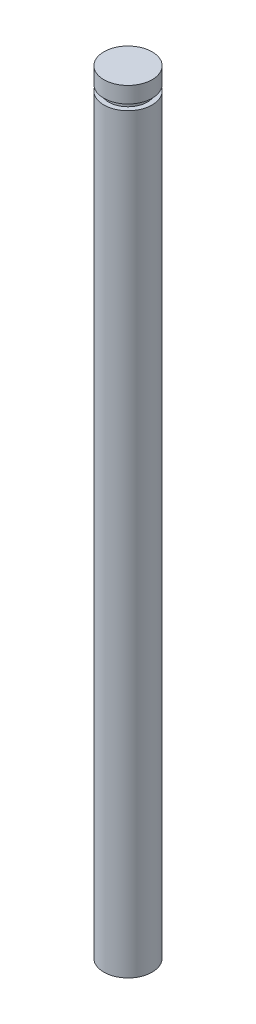
ISO-10303-21;
HEADER;
FILE_DESCRIPTION(('STEP AP214'),'2;1');
FILE_NAME('part.step','',(''),(''),'','','');
FILE_SCHEMA(('AUTOMOTIVE_DESIGN { 1 0 10303 214 1 1 1 1 }'));
ENDSEC;
DATA;
#1=APPLICATION_CONTEXT('core data for automotive mechanical design processes');
#2=APPLICATION_PROTOCOL_DEFINITION('international standard','automotive_design',2000,#1);
#3=PRODUCT_CONTEXT('',#1,'mechanical');
#4=PRODUCT('Part','Part','',(#3));
#5=PRODUCT_RELATED_PRODUCT_CATEGORY('part','',(#4));
#6=PRODUCT_DEFINITION_FORMATION('','',#4);
#7=PRODUCT_DEFINITION_CONTEXT('part definition',#1,'design');
#8=PRODUCT_DEFINITION('design','',#6,#7);
#9=PRODUCT_DEFINITION_SHAPE('','',#8);
#10=(LENGTH_UNIT() NAMED_UNIT(*) SI_UNIT(.MILLI.,.METRE.));
#11=(NAMED_UNIT(*) PLANE_ANGLE_UNIT() SI_UNIT($,.RADIAN.));
#12=(NAMED_UNIT(*) SI_UNIT($,.STERADIAN.) SOLID_ANGLE_UNIT());
#13=UNCERTAINTY_MEASURE_WITH_UNIT(LENGTH_MEASURE(1.E-05),#10,'distance_accuracy_value','');
#14=(GEOMETRIC_REPRESENTATION_CONTEXT(3) GLOBAL_UNCERTAINTY_ASSIGNED_CONTEXT((#13)) GLOBAL_UNIT_ASSIGNED_CONTEXT((#10,
#11,#12)) REPRESENTATION_CONTEXT('',''));
#15=CARTESIAN_POINT('',(0.,0.,0.));
#16=DIRECTION('',(0.,0.,1.));
#17=DIRECTION('',(1.,0.,0.));
#18=AXIS2_PLACEMENT_3D('',#15,#16,#17);
#19=CARTESIAN_POINT('',(0.,12.5,0.));
#20=DIRECTION('',(0.,-1.,0.));
#21=DIRECTION('',(0.,0.,-1.));
#22=AXIS2_PLACEMENT_3D('',#19,#20,#21);
#23=CYLINDRICAL_SURFACE('',#22,18.75);
#24=CARTESIAN_POINT('',(0.,12.5,0.));
#25=DIRECTION('',(0.,1.,0.));
#26=DIRECTION('',(0.,0.,1.));
#27=AXIS2_PLACEMENT_3D('',#24,#25,#26);
#28=CIRCLE('',#27,18.75);
#29=CARTESIAN_POINT('',(0.,12.5,18.75));
#30=VERTEX_POINT('',#29);
#31=EDGE_CURVE('E38',#30,#30,#28,.T.);
#32=ORIENTED_EDGE('',*,*,#31,.F.);
#33=EDGE_LOOP('',(#32));
#34=FACE_BOUND('',#33,.T.);
#35=CARTESIAN_POINT('',(0.,0.,0.));
#36=DIRECTION('',(0.,1.,0.));
#37=DIRECTION('',(0.,0.,1.));
#38=AXIS2_PLACEMENT_3D('',#35,#36,#37);
#39=CIRCLE('',#38,18.75);
#40=CARTESIAN_POINT('',(0.,0.,18.75));
#41=VERTEX_POINT('',#40);
#42=EDGE_CURVE('E34',#41,#41,#39,.T.);
#43=ORIENTED_EDGE('',*,*,#42,.T.);
#44=EDGE_LOOP('',(#43));
#45=FACE_BOUND('',#44,.T.);
#46=ADVANCED_FACE('F31',(#34,#45),#23,.T.);
#47=CARTESIAN_POINT('',(0.,12.5,0.));
#48=DIRECTION('',(0.,1.,0.));
#49=DIRECTION('',(0.,0.,1.));
#50=AXIS2_PLACEMENT_3D('',#47,#48,#49);
#51=PLANE('',#50);
#52=ORIENTED_EDGE('',*,*,#31,.T.);
#53=EDGE_LOOP('',(#52));
#54=FACE_BOUND('',#53,.T.);
#55=ADVANCED_FACE('F72',(#54),#51,.T.);
#56=CARTESIAN_POINT('',(0.,0.,0.));
#57=DIRECTION('',(0.,1.,0.));
#58=DIRECTION('',(0.,0.,1.));
#59=AXIS2_PLACEMENT_3D('',#56,#57,#58);
#60=PLANE('',#59);
#61=CARTESIAN_POINT('',(0.,0.,0.));
#62=DIRECTION('',(0.,-1.,0.));
#63=DIRECTION('',(0.,0.,-1.));
#64=AXIS2_PLACEMENT_3D('',#61,#62,#63);
#65=CIRCLE('',#64,15.);
#66=CARTESIAN_POINT('',(0.,0.,-15.));
#67=VERTEX_POINT('',#66);
#68=EDGE_CURVE('E10',#67,#67,#65,.T.);
#69=ORIENTED_EDGE('',*,*,#68,.F.);
#70=EDGE_LOOP('',(#69));
#71=FACE_BOUND('',#70,.T.);
#72=ORIENTED_EDGE('',*,*,#42,.F.);
#73=EDGE_LOOP('',(#72));
#74=FACE_BOUND('',#73,.T.);
#75=ADVANCED_FACE('F77',(#71,#74),#60,.F.);
#76=CARTESIAN_POINT('',(0.,-4.5,0.));
#77=DIRECTION('',(0.,1.,0.));
#78=DIRECTION('',(0.,0.,1.));
#79=AXIS2_PLACEMENT_3D('',#76,#77,#78);
#80=CYLINDRICAL_SURFACE('',#79,15.);
#81=CARTESIAN_POINT('',(0.,-4.5,0.));
#82=DIRECTION('',(0.,-1.,0.));
#83=DIRECTION('',(0.,0.,-1.));
#84=AXIS2_PLACEMENT_3D('',#81,#82,#83);
#85=CIRCLE('',#84,15.);
#86=CARTESIAN_POINT('',(0.,-4.5,-15.));
#87=VERTEX_POINT('',#86);
#88=EDGE_CURVE('E44',#87,#87,#85,.T.);
#89=ORIENTED_EDGE('',*,*,#88,.F.);
#90=EDGE_LOOP('',(#89));
#91=FACE_BOUND('',#90,.T.);
#92=ORIENTED_EDGE('',*,*,#68,.T.);
#93=EDGE_LOOP('',(#92));
#94=FACE_BOUND('',#93,.T.);
#95=ADVANCED_FACE('F59',(#91,#94),#80,.T.);
#96=CARTESIAN_POINT('',(0.,-587.5,0.));
#97=DIRECTION('',(0.,1.,0.));
#98=DIRECTION('',(0.,0.,1.));
#99=AXIS2_PLACEMENT_3D('',#96,#97,#98);
#100=CYLINDRICAL_SURFACE('',#99,18.75);
#101=CARTESIAN_POINT('',(0.,-587.5,0.));
#102=DIRECTION('',(0.,-1.,0.));
#103=DIRECTION('',(0.,0.,-1.));
#104=AXIS2_PLACEMENT_3D('',#101,#102,#103);
#105=CIRCLE('',#104,18.75);
#106=CARTESIAN_POINT('',(0.,-587.5,-18.75));
#107=VERTEX_POINT('',#106);
#108=EDGE_CURVE('E47',#107,#107,#105,.T.);
#109=ORIENTED_EDGE('',*,*,#108,.F.);
#110=EDGE_LOOP('',(#109));
#111=FACE_BOUND('',#110,.T.);
#112=CARTESIAN_POINT('',(0.,-4.5,0.));
#113=DIRECTION('',(0.,-1.,0.));
#114=DIRECTION('',(0.,0.,-1.));
#115=AXIS2_PLACEMENT_3D('',#112,#113,#114);
#116=CIRCLE('',#115,18.75);
#117=CARTESIAN_POINT('',(0.,-4.5,-18.75));
#118=VERTEX_POINT('',#117);
#119=EDGE_CURVE('E48',#118,#118,#116,.T.);
#120=ORIENTED_EDGE('',*,*,#119,.T.);
#121=EDGE_LOOP('',(#120));
#122=FACE_BOUND('',#121,.T.);
#123=ADVANCED_FACE('F56',(#111,#122),#100,.T.);
#124=CARTESIAN_POINT('',(0.,-587.5,0.));
#125=DIRECTION('',(0.,-1.,0.));
#126=DIRECTION('',(0.,0.,-1.));
#127=AXIS2_PLACEMENT_3D('',#124,#125,#126);
#128=PLANE('',#127);
#129=ORIENTED_EDGE('',*,*,#108,.T.);
#130=EDGE_LOOP('',(#129));
#131=FACE_BOUND('',#130,.T.);
#132=ADVANCED_FACE('F54',(#131),#128,.T.);
#133=CARTESIAN_POINT('',(0.,-4.5,0.));
#134=DIRECTION('',(0.,-1.,0.));
#135=DIRECTION('',(0.,0.,-1.));
#136=AXIS2_PLACEMENT_3D('',#133,#134,#135);
#137=PLANE('',#136);
#138=ORIENTED_EDGE('',*,*,#88,.T.);
#139=EDGE_LOOP('',(#138));
#140=FACE_BOUND('',#139,.T.);
#141=ORIENTED_EDGE('',*,*,#119,.F.);
#142=EDGE_LOOP('',(#141));
#143=FACE_BOUND('',#142,.T.);
#144=ADVANCED_FACE('F63',(#140,#143),#137,.F.);
#145=CLOSED_SHELL('',(#46,#55,#75,#95,#123,#132,#144));
#146=MANIFOLD_SOLID_BREP('B2',#145);
#147=ADVANCED_BREP_SHAPE_REPRESENTATION('',(#18,#146),#14);
#148=SHAPE_DEFINITION_REPRESENTATION(#9,#147);
ENDSEC;
END-ISO-10303-21;
